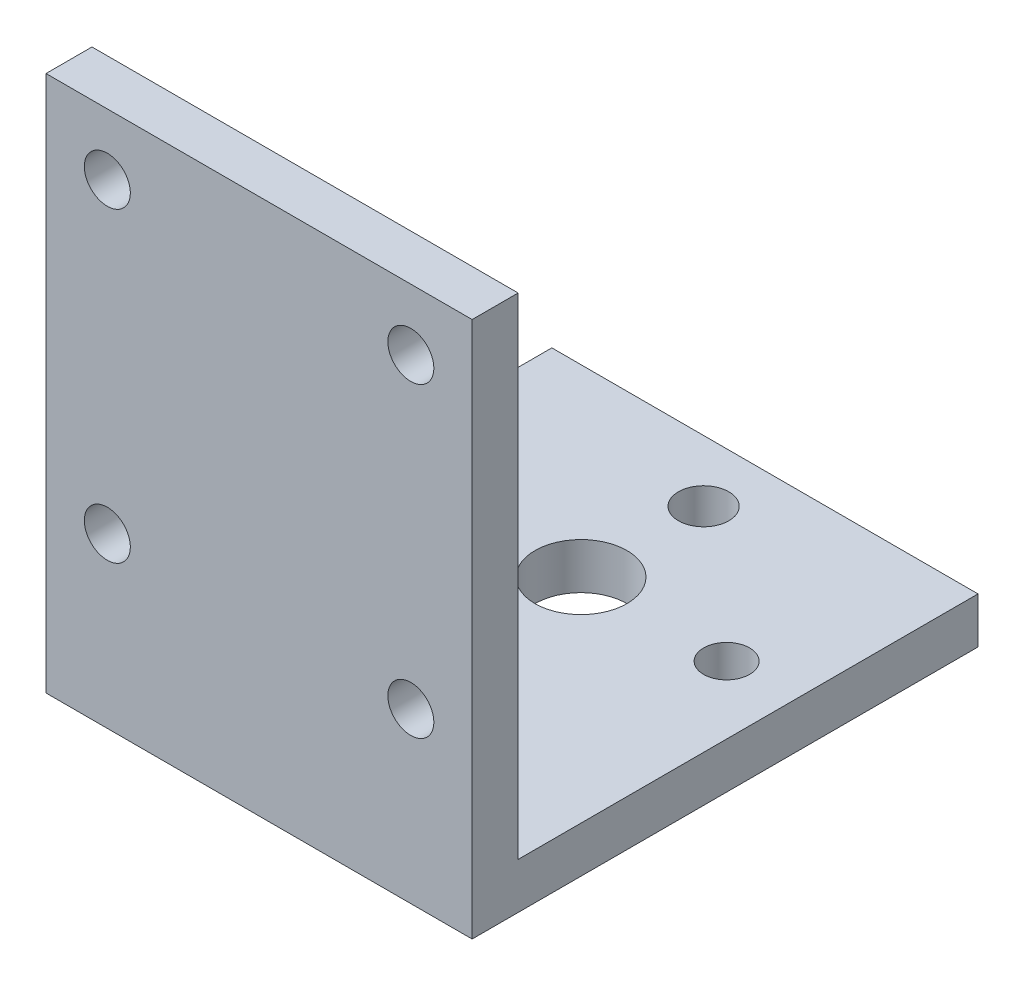
ISO-10303-21;
HEADER;
FILE_DESCRIPTION(('STEP AP214'),'2;1');
FILE_NAME('part.step','',(''),(''),'','','');
FILE_SCHEMA(('AUTOMOTIVE_DESIGN { 1 0 10303 214 1 1 1 1 }'));
ENDSEC;
DATA;
#1=APPLICATION_CONTEXT('core data for automotive mechanical design processes');
#2=APPLICATION_PROTOCOL_DEFINITION('international standard','automotive_design',2000,#1);
#3=PRODUCT_CONTEXT('',#1,'mechanical');
#4=PRODUCT('Part','Part','',(#3));
#5=PRODUCT_RELATED_PRODUCT_CATEGORY('part','',(#4));
#6=PRODUCT_DEFINITION_FORMATION('','',#4);
#7=PRODUCT_DEFINITION_CONTEXT('part definition',#1,'design');
#8=PRODUCT_DEFINITION('design','',#6,#7);
#9=PRODUCT_DEFINITION_SHAPE('','',#8);
#10=(LENGTH_UNIT() NAMED_UNIT(*) SI_UNIT(.MILLI.,.METRE.));
#11=(NAMED_UNIT(*) PLANE_ANGLE_UNIT() SI_UNIT($,.RADIAN.));
#12=(NAMED_UNIT(*) SI_UNIT($,.STERADIAN.) SOLID_ANGLE_UNIT());
#13=UNCERTAINTY_MEASURE_WITH_UNIT(LENGTH_MEASURE(1.E-05),#10,'distance_accuracy_value','');
#14=(GEOMETRIC_REPRESENTATION_CONTEXT(3) GLOBAL_UNCERTAINTY_ASSIGNED_CONTEXT((#13)) GLOBAL_UNIT_ASSIGNED_CONTEXT((#10,
#11,#12)) REPRESENTATION_CONTEXT('',''));
#15=CARTESIAN_POINT('',(0.,0.,0.));
#16=DIRECTION('',(0.,0.,1.));
#17=DIRECTION('',(1.,0.,0.));
#18=AXIS2_PLACEMENT_3D('',#15,#16,#17);
#19=CARTESIAN_POINT('',(0.,3.,0.));
#20=DIRECTION('',(0.,1.,0.));
#21=DIRECTION('',(0.,0.,1.));
#22=AXIS2_PLACEMENT_3D('',#19,#20,#21);
#23=PLANE('',#22);
#24=DIRECTION('',(-1.,0.,0.));
#25=VECTOR('',#24,1.);
#26=CARTESIAN_POINT('',(-77.7120976944037,3.,18.2292982112196));
#27=LINE('',#26,#25);
#28=CARTESIAN_POINT('',(-49.9120976944037,3.,18.2292982112196));
#29=VERTEX_POINT('',#28);
#30=CARTESIAN_POINT('',(-77.7120976944037,3.,18.2292982112196));
#31=VERTEX_POINT('',#30);
#32=EDGE_CURVE('E65',#29,#31,#27,.T.);
#33=ORIENTED_EDGE('',*,*,#32,.F.);
#34=DIRECTION('',(0.,0.,-1.));
#35=VECTOR('',#34,1.);
#36=CARTESIAN_POINT('',(-49.9120976944037,3.,-11.7707017887804));
#37=LINE('',#36,#35);
#38=CARTESIAN_POINT('',(-49.9120976944037,3.,-11.7707017887804));
#39=VERTEX_POINT('',#38);
#40=EDGE_CURVE('E210',#29,#39,#37,.T.);
#41=ORIENTED_EDGE('',*,*,#40,.T.);
#42=DIRECTION('',(-1.,0.,0.));
#43=VECTOR('',#42,1.);
#44=CARTESIAN_POINT('',(-77.7120976944037,3.,-11.7707017887804));
#45=LINE('',#44,#43);
#46=CARTESIAN_POINT('',(-77.7120976944037,3.,-11.7707017887804));
#47=VERTEX_POINT('',#46);
#48=EDGE_CURVE('E71',#39,#47,#45,.T.);
#49=ORIENTED_EDGE('',*,*,#48,.T.);
#50=DIRECTION('',(0.,0.,1.));
#51=VECTOR('',#50,1.);
#52=CARTESIAN_POINT('',(-77.7120976944037,3.,-11.7707017887804));
#53=LINE('',#52,#51);
#54=EDGE_CURVE('E101',#47,#31,#53,.T.);
#55=ORIENTED_EDGE('',*,*,#54,.T.);
#56=EDGE_LOOP('',(#33,#41,#49,#55));
#57=FACE_BOUND('',#56,.T.);
#58=CARTESIAN_POINT('',(-73.3120976944037,3.,0.229298211219559));
#59=DIRECTION('',(0.,1.,0.));
#60=DIRECTION('',(0.,0.,1.));
#61=AXIS2_PLACEMENT_3D('',#58,#59,#60);
#62=CIRCLE('',#61,1.5);
#63=CARTESIAN_POINT('',(-73.3120976944037,3.,1.72929821121956));
#64=VERTEX_POINT('',#63);
#65=EDGE_CURVE('E183',#64,#64,#62,.T.);
#66=ORIENTED_EDGE('',*,*,#65,.F.);
#67=EDGE_LOOP('',(#66));
#68=FACE_BOUND('',#67,.T.);
#69=CARTESIAN_POINT('',(-63.8120976944037,3.,0.229298211219559));
#70=DIRECTION('',(0.,1.,0.));
#71=DIRECTION('',(0.,0.,1.));
#72=AXIS2_PLACEMENT_3D('',#69,#70,#71);
#73=CIRCLE('',#72,3.);
#74=CARTESIAN_POINT('',(-63.8120976944037,3.,3.22929821121956));
#75=VERTEX_POINT('',#74);
#76=EDGE_CURVE('E199',#75,#75,#73,.T.);
#77=ORIENTED_EDGE('',*,*,#76,.F.);
#78=EDGE_LOOP('',(#77));
#79=FACE_BOUND('',#78,.T.);
#80=CARTESIAN_POINT('',(-63.8120976944037,3.,-7.77070178878044));
#81=DIRECTION('',(0.,1.,0.));
#82=DIRECTION('',(0.,0.,1.));
#83=AXIS2_PLACEMENT_3D('',#80,#81,#82);
#84=CIRCLE('',#83,1.64313429517779);
#85=CARTESIAN_POINT('',(-63.8120976944037,3.,-6.12756749360265));
#86=VERTEX_POINT('',#85);
#87=EDGE_CURVE('E115',#86,#86,#84,.T.);
#88=ORIENTED_EDGE('',*,*,#87,.F.);
#89=EDGE_LOOP('',(#88));
#90=FACE_BOUND('',#89,.T.);
#91=CARTESIAN_POINT('',(-63.8120976944037,3.,8.22929821121956));
#92=DIRECTION('',(0.,1.,0.));
#93=DIRECTION('',(0.,0.,1.));
#94=AXIS2_PLACEMENT_3D('',#91,#92,#93);
#95=CIRCLE('',#94,1.5);
#96=CARTESIAN_POINT('',(-63.8120976944037,3.,9.72929821121956));
#97=VERTEX_POINT('',#96);
#98=EDGE_CURVE('E191',#97,#97,#95,.T.);
#99=ORIENTED_EDGE('',*,*,#98,.F.);
#100=EDGE_LOOP('',(#99));
#101=FACE_BOUND('',#100,.T.);
#102=CARTESIAN_POINT('',(-54.3120976944037,3.,0.229298211219559));
#103=DIRECTION('',(0.,1.,0.));
#104=DIRECTION('',(0.,0.,1.));
#105=AXIS2_PLACEMENT_3D('',#102,#103,#104);
#106=CIRCLE('',#105,1.5);
#107=CARTESIAN_POINT('',(-54.3120976944037,3.,1.72929821121956));
#108=VERTEX_POINT('',#107);
#109=EDGE_CURVE('E175',#108,#108,#106,.T.);
#110=ORIENTED_EDGE('',*,*,#109,.F.);
#111=EDGE_LOOP('',(#110));
#112=FACE_BOUND('',#111,.T.);
#113=ADVANCED_FACE('F49',(#57,#68,#79,#90,#101,#112),#23,.T.);
#114=CARTESIAN_POINT('',(0.,0.,0.));
#115=DIRECTION('',(0.,1.,0.));
#116=DIRECTION('',(0.,0.,1.));
#117=AXIS2_PLACEMENT_3D('',#114,#115,#116);
#118=PLANE('',#117);
#119=DIRECTION('',(0.,0.,1.));
#120=VECTOR('',#119,1.);
#121=CARTESIAN_POINT('',(-77.7120976944037,0.,-11.7707017887804));
#122=LINE('',#121,#120);
#123=CARTESIAN_POINT('',(-77.7120976944037,0.,-11.7707017887804));
#124=VERTEX_POINT('',#123);
#125=CARTESIAN_POINT('',(-77.7120976944037,0.,21.2292982112196));
#126=VERTEX_POINT('',#125);
#127=EDGE_CURVE('E107',#124,#126,#122,.T.);
#128=ORIENTED_EDGE('',*,*,#127,.F.);
#129=DIRECTION('',(-1.,0.,0.));
#130=VECTOR('',#129,1.);
#131=CARTESIAN_POINT('',(-77.7120976944037,0.,-11.7707017887804));
#132=LINE('',#131,#130);
#133=CARTESIAN_POINT('',(-49.9120976944037,0.,-11.7707017887804));
#134=VERTEX_POINT('',#133);
#135=EDGE_CURVE('E90',#134,#124,#132,.T.);
#136=ORIENTED_EDGE('',*,*,#135,.F.);
#137=DIRECTION('',(0.,0.,-1.));
#138=VECTOR('',#137,1.);
#139=CARTESIAN_POINT('',(-49.9120976944037,0.,-11.7707017887804));
#140=LINE('',#139,#138);
#141=CARTESIAN_POINT('',(-49.9120976944037,0.,21.2292982112196));
#142=VERTEX_POINT('',#141);
#143=EDGE_CURVE('E102',#142,#134,#140,.T.);
#144=ORIENTED_EDGE('',*,*,#143,.F.);
#145=DIRECTION('',(1.,0.,0.));
#146=VECTOR('',#145,1.);
#147=CARTESIAN_POINT('',(-77.7120976944037,0.,21.2292982112196));
#148=LINE('',#147,#146);
#149=EDGE_CURVE('E113',#126,#142,#148,.T.);
#150=ORIENTED_EDGE('',*,*,#149,.F.);
#151=EDGE_LOOP('',(#128,#136,#144,#150));
#152=FACE_BOUND('',#151,.T.);
#153=CARTESIAN_POINT('',(-63.8120976944037,0.,-7.77070178878044));
#154=DIRECTION('',(0.,1.,0.));
#155=DIRECTION('',(0.,0.,1.));
#156=AXIS2_PLACEMENT_3D('',#153,#154,#155);
#157=CIRCLE('',#156,1.64313429517779);
#158=CARTESIAN_POINT('',(-63.8120976944037,0.,-6.12756749360265));
#159=VERTEX_POINT('',#158);
#160=EDGE_CURVE('E121',#159,#159,#157,.T.);
#161=ORIENTED_EDGE('',*,*,#160,.T.);
#162=EDGE_LOOP('',(#161));
#163=FACE_BOUND('',#162,.T.);
#164=CARTESIAN_POINT('',(-63.8120976944037,0.,0.229298211219559));
#165=DIRECTION('',(0.,1.,0.));
#166=DIRECTION('',(0.,0.,1.));
#167=AXIS2_PLACEMENT_3D('',#164,#165,#166);
#168=CIRCLE('',#167,3.);
#169=CARTESIAN_POINT('',(-63.8120976944037,0.,3.22929821121956));
#170=VERTEX_POINT('',#169);
#171=EDGE_CURVE('E195',#170,#170,#168,.T.);
#172=ORIENTED_EDGE('',*,*,#171,.T.);
#173=EDGE_LOOP('',(#172));
#174=FACE_BOUND('',#173,.T.);
#175=CARTESIAN_POINT('',(-63.8120976944037,0.,8.22929821121956));
#176=DIRECTION('',(0.,1.,0.));
#177=DIRECTION('',(0.,0.,1.));
#178=AXIS2_PLACEMENT_3D('',#175,#176,#177);
#179=CIRCLE('',#178,1.5);
#180=CARTESIAN_POINT('',(-63.8120976944037,0.,9.72929821121956));
#181=VERTEX_POINT('',#180);
#182=EDGE_CURVE('E187',#181,#181,#179,.T.);
#183=ORIENTED_EDGE('',*,*,#182,.T.);
#184=EDGE_LOOP('',(#183));
#185=FACE_BOUND('',#184,.T.);
#186=CARTESIAN_POINT('',(-73.3120976944037,0.,0.229298211219559));
#187=DIRECTION('',(0.,1.,0.));
#188=DIRECTION('',(0.,0.,1.));
#189=AXIS2_PLACEMENT_3D('',#186,#187,#188);
#190=CIRCLE('',#189,1.5);
#191=CARTESIAN_POINT('',(-73.3120976944037,0.,1.72929821121956));
#192=VERTEX_POINT('',#191);
#193=EDGE_CURVE('E179',#192,#192,#190,.T.);
#194=ORIENTED_EDGE('',*,*,#193,.T.);
#195=EDGE_LOOP('',(#194));
#196=FACE_BOUND('',#195,.T.);
#197=CARTESIAN_POINT('',(-54.3120976944037,0.,0.229298211219559));
#198=DIRECTION('',(0.,1.,0.));
#199=DIRECTION('',(0.,0.,1.));
#200=AXIS2_PLACEMENT_3D('',#197,#198,#199);
#201=CIRCLE('',#200,1.5);
#202=CARTESIAN_POINT('',(-54.3120976944037,0.,1.72929821121956));
#203=VERTEX_POINT('',#202);
#204=EDGE_CURVE('E174',#203,#203,#201,.T.);
#205=ORIENTED_EDGE('',*,*,#204,.T.);
#206=EDGE_LOOP('',(#205));
#207=FACE_BOUND('',#206,.T.);
#208=ADVANCED_FACE('F111',(#152,#163,#174,#185,#196,#207),#118,.F.);
#209=CARTESIAN_POINT('',(-77.7120976944037,3.,-11.7707017887804));
#210=DIRECTION('',(1.,0.,0.));
#211=DIRECTION('',(0.,0.,-1.));
#212=AXIS2_PLACEMENT_3D('',#209,#210,#211);
#213=PLANE('',#212);
#214=ORIENTED_EDGE('',*,*,#127,.T.);
#215=DIRECTION('',(0.,-1.,0.));
#216=VECTOR('',#215,1.);
#217=CARTESIAN_POINT('',(-77.7120976944037,3.,21.2292982112196));
#218=LINE('',#217,#216);
#219=CARTESIAN_POINT('',(-77.7120976944037,35.,21.2292982112196));
#220=VERTEX_POINT('',#219);
#221=EDGE_CURVE('E12',#220,#126,#218,.T.);
#222=ORIENTED_EDGE('',*,*,#221,.F.);
#223=DIRECTION('',(0.,0.,1.));
#224=VECTOR('',#223,1.);
#225=CARTESIAN_POINT('',(-77.7120976944037,35.,18.2292982112196));
#226=LINE('',#225,#224);
#227=CARTESIAN_POINT('',(-77.7120976944037,35.,18.2292982112196));
#228=VERTEX_POINT('',#227);
#229=EDGE_CURVE('E152',#228,#220,#226,.T.);
#230=ORIENTED_EDGE('',*,*,#229,.F.);
#231=DIRECTION('',(0.,-1.,0.));
#232=VECTOR('',#231,1.);
#233=CARTESIAN_POINT('',(-77.7120976944037,35.,18.2292982112196));
#234=LINE('',#233,#232);
#235=EDGE_CURVE('E164',#228,#31,#234,.T.);
#236=ORIENTED_EDGE('',*,*,#235,.T.);
#237=ORIENTED_EDGE('',*,*,#54,.F.);
#238=DIRECTION('',(0.,-1.,0.));
#239=VECTOR('',#238,1.);
#240=CARTESIAN_POINT('',(-77.7120976944037,3.,-11.7707017887804));
#241=LINE('',#240,#239);
#242=EDGE_CURVE('E93',#47,#124,#241,.T.);
#243=ORIENTED_EDGE('',*,*,#242,.T.);
#244=EDGE_LOOP('',(#214,#222,#230,#236,#237,#243));
#245=FACE_BOUND('',#244,.T.);
#246=ADVANCED_FACE('F51',(#245),#213,.F.);
#247=CARTESIAN_POINT('',(-77.7120976944037,3.,21.2292982112196));
#248=DIRECTION('',(0.,0.,-1.));
#249=DIRECTION('',(-1.,0.,0.));
#250=AXIS2_PLACEMENT_3D('',#247,#248,#249);
#251=PLANE('',#250);
#252=CARTESIAN_POINT('',(-73.7120976944037,11.,21.2292982112196));
#253=DIRECTION('',(0.,0.,-1.));
#254=DIRECTION('',(-1.,0.,0.));
#255=AXIS2_PLACEMENT_3D('',#252,#253,#254);
#256=CIRCLE('',#255,1.5);
#257=CARTESIAN_POINT('',(-75.2120976944037,11.,21.2292982112196));
#258=VERTEX_POINT('',#257);
#259=EDGE_CURVE('E167',#258,#258,#256,.T.);
#260=ORIENTED_EDGE('',*,*,#259,.T.);
#261=EDGE_LOOP('',(#260));
#262=FACE_BOUND('',#261,.T.);
#263=CARTESIAN_POINT('',(-53.9120976944037,31.,21.2292982112196));
#264=DIRECTION('',(0.,0.,-1.));
#265=DIRECTION('',(-1.,0.,0.));
#266=AXIS2_PLACEMENT_3D('',#263,#264,#265);
#267=CIRCLE('',#266,1.5);
#268=CARTESIAN_POINT('',(-55.4120976944037,31.,21.2292982112196));
#269=VERTEX_POINT('',#268);
#270=EDGE_CURVE('E261',#269,#269,#267,.T.);
#271=ORIENTED_EDGE('',*,*,#270,.T.);
#272=EDGE_LOOP('',(#271));
#273=FACE_BOUND('',#272,.T.);
#274=CARTESIAN_POINT('',(-73.7120976944037,31.,21.2292982112196));
#275=DIRECTION('',(0.,0.,-1.));
#276=DIRECTION('',(-1.,0.,0.));
#277=AXIS2_PLACEMENT_3D('',#274,#275,#276);
#278=CIRCLE('',#277,1.5);
#279=CARTESIAN_POINT('',(-75.2120976944037,31.,21.2292982112196));
#280=VERTEX_POINT('',#279);
#281=EDGE_CURVE('E265',#280,#280,#278,.T.);
#282=ORIENTED_EDGE('',*,*,#281,.T.);
#283=EDGE_LOOP('',(#282));
#284=FACE_BOUND('',#283,.T.);
#285=CARTESIAN_POINT('',(-53.9120976944037,11.,21.2292982112196));
#286=DIRECTION('',(0.,0.,-1.));
#287=DIRECTION('',(-1.,0.,0.));
#288=AXIS2_PLACEMENT_3D('',#285,#286,#287);
#289=CIRCLE('',#288,1.5);
#290=CARTESIAN_POINT('',(-55.4120976944037,11.,21.2292982112196));
#291=VERTEX_POINT('',#290);
#292=EDGE_CURVE('E268',#291,#291,#289,.T.);
#293=ORIENTED_EDGE('',*,*,#292,.T.);
#294=EDGE_LOOP('',(#293));
#295=FACE_BOUND('',#294,.T.);
#296=ORIENTED_EDGE('',*,*,#149,.T.);
#297=DIRECTION('',(0.,-1.,0.));
#298=VECTOR('',#297,1.);
#299=CARTESIAN_POINT('',(-49.9120976944037,3.,21.2292982112196));
#300=LINE('',#299,#298);
#301=CARTESIAN_POINT('',(-49.9120976944037,35.,21.2292982112196));
#302=VERTEX_POINT('',#301);
#303=EDGE_CURVE('E58',#302,#142,#300,.T.);
#304=ORIENTED_EDGE('',*,*,#303,.F.);
#305=DIRECTION('',(1.,0.,0.));
#306=VECTOR('',#305,1.);
#307=CARTESIAN_POINT('',(-77.7120976944037,35.,21.2292982112196));
#308=LINE('',#307,#306);
#309=EDGE_CURVE('E144',#220,#302,#308,.T.);
#310=ORIENTED_EDGE('',*,*,#309,.F.);
#311=ORIENTED_EDGE('',*,*,#221,.T.);
#312=EDGE_LOOP('',(#296,#304,#310,#311));
#313=FACE_BOUND('',#312,.T.);
#314=ADVANCED_FACE('F142',(#262,#273,#284,#295,#313),#251,.F.);
#315=CARTESIAN_POINT('',(-49.9120976944037,3.,-11.7707017887804));
#316=DIRECTION('',(-1.,0.,0.));
#317=DIRECTION('',(0.,0.,1.));
#318=AXIS2_PLACEMENT_3D('',#315,#316,#317);
#319=PLANE('',#318);
#320=ORIENTED_EDGE('',*,*,#143,.T.);
#321=DIRECTION('',(0.,-1.,0.));
#322=VECTOR('',#321,1.);
#323=CARTESIAN_POINT('',(-49.9120976944037,3.,-11.7707017887804));
#324=LINE('',#323,#322);
#325=EDGE_CURVE('E96',#39,#134,#324,.T.);
#326=ORIENTED_EDGE('',*,*,#325,.F.);
#327=ORIENTED_EDGE('',*,*,#40,.F.);
#328=DIRECTION('',(0.,-1.,0.));
#329=VECTOR('',#328,1.);
#330=CARTESIAN_POINT('',(-49.9120976944037,35.,18.2292982112196));
#331=LINE('',#330,#329);
#332=CARTESIAN_POINT('',(-49.9120976944037,35.,18.2292982112196));
#333=VERTEX_POINT('',#332);
#334=EDGE_CURVE('E170',#333,#29,#331,.T.);
#335=ORIENTED_EDGE('',*,*,#334,.F.);
#336=DIRECTION('',(0.,0.,-1.));
#337=VECTOR('',#336,1.);
#338=CARTESIAN_POINT('',(-49.9120976944037,35.,18.2292982112196));
#339=LINE('',#338,#337);
#340=EDGE_CURVE('E138',#302,#333,#339,.T.);
#341=ORIENTED_EDGE('',*,*,#340,.F.);
#342=ORIENTED_EDGE('',*,*,#303,.T.);
#343=EDGE_LOOP('',(#320,#326,#327,#335,#341,#342));
#344=FACE_BOUND('',#343,.T.);
#345=ADVANCED_FACE('F134',(#344),#319,.F.);
#346=CARTESIAN_POINT('',(-77.7120976944037,3.,-11.7707017887804));
#347=DIRECTION('',(0.,0.,1.));
#348=DIRECTION('',(1.,0.,0.));
#349=AXIS2_PLACEMENT_3D('',#346,#347,#348);
#350=PLANE('',#349);
#351=ORIENTED_EDGE('',*,*,#135,.T.);
#352=ORIENTED_EDGE('',*,*,#242,.F.);
#353=ORIENTED_EDGE('',*,*,#48,.F.);
#354=ORIENTED_EDGE('',*,*,#325,.T.);
#355=EDGE_LOOP('',(#351,#352,#353,#354));
#356=FACE_BOUND('',#355,.T.);
#357=ADVANCED_FACE('F92',(#356),#350,.F.);
#358=CARTESIAN_POINT('',(-63.8120976944037,3.,-7.77070178878044));
#359=DIRECTION('',(0.,-1.,0.));
#360=DIRECTION('',(0.,0.,-1.));
#361=AXIS2_PLACEMENT_3D('',#358,#359,#360);
#362=CYLINDRICAL_SURFACE('',#361,1.64313429517779);
#363=ORIENTED_EDGE('',*,*,#87,.T.);
#364=EDGE_LOOP('',(#363));
#365=FACE_BOUND('',#364,.T.);
#366=ORIENTED_EDGE('',*,*,#160,.F.);
#367=EDGE_LOOP('',(#366));
#368=FACE_BOUND('',#367,.T.);
#369=ADVANCED_FACE('F244',(#365,#368),#362,.F.);
#370=CARTESIAN_POINT('',(-63.8120976944037,3.,0.229298211219559));
#371=DIRECTION('',(0.,-1.,0.));
#372=DIRECTION('',(0.,0.,-1.));
#373=AXIS2_PLACEMENT_3D('',#370,#371,#372);
#374=CYLINDRICAL_SURFACE('',#373,3.);
#375=ORIENTED_EDGE('',*,*,#76,.T.);
#376=EDGE_LOOP('',(#375));
#377=FACE_BOUND('',#376,.T.);
#378=ORIENTED_EDGE('',*,*,#171,.F.);
#379=EDGE_LOOP('',(#378));
#380=FACE_BOUND('',#379,.T.);
#381=ADVANCED_FACE('F416',(#377,#380),#374,.F.);
#382=CARTESIAN_POINT('',(-63.8120976944037,3.,8.22929821121956));
#383=DIRECTION('',(0.,-1.,0.));
#384=DIRECTION('',(0.,0.,-1.));
#385=AXIS2_PLACEMENT_3D('',#382,#383,#384);
#386=CYLINDRICAL_SURFACE('',#385,1.5);
#387=ORIENTED_EDGE('',*,*,#98,.T.);
#388=EDGE_LOOP('',(#387));
#389=FACE_BOUND('',#388,.T.);
#390=ORIENTED_EDGE('',*,*,#182,.F.);
#391=EDGE_LOOP('',(#390));
#392=FACE_BOUND('',#391,.T.);
#393=ADVANCED_FACE('F405',(#389,#392),#386,.F.);
#394=CARTESIAN_POINT('',(-73.3120976944037,3.,0.229298211219559));
#395=DIRECTION('',(0.,-1.,0.));
#396=DIRECTION('',(0.,0.,-1.));
#397=AXIS2_PLACEMENT_3D('',#394,#395,#396);
#398=CYLINDRICAL_SURFACE('',#397,1.5);
#399=ORIENTED_EDGE('',*,*,#65,.T.);
#400=EDGE_LOOP('',(#399));
#401=FACE_BOUND('',#400,.T.);
#402=ORIENTED_EDGE('',*,*,#193,.F.);
#403=EDGE_LOOP('',(#402));
#404=FACE_BOUND('',#403,.T.);
#405=ADVANCED_FACE('F232',(#401,#404),#398,.F.);
#406=CARTESIAN_POINT('',(-54.3120976944037,3.,0.229298211219559));
#407=DIRECTION('',(0.,-1.,0.));
#408=DIRECTION('',(0.,0.,-1.));
#409=AXIS2_PLACEMENT_3D('',#406,#407,#408);
#410=CYLINDRICAL_SURFACE('',#409,1.5);
#411=ORIENTED_EDGE('',*,*,#109,.T.);
#412=EDGE_LOOP('',(#411));
#413=FACE_BOUND('',#412,.T.);
#414=ORIENTED_EDGE('',*,*,#204,.F.);
#415=EDGE_LOOP('',(#414));
#416=FACE_BOUND('',#415,.T.);
#417=ADVANCED_FACE('F223',(#413,#416),#410,.F.);
#418=CARTESIAN_POINT('',(-77.7120976944037,35.,18.2292982112196));
#419=DIRECTION('',(0.,0.,1.));
#420=DIRECTION('',(1.,0.,0.));
#421=AXIS2_PLACEMENT_3D('',#418,#419,#420);
#422=PLANE('',#421);
#423=CARTESIAN_POINT('',(-73.7120976944037,11.,18.2292982112196));
#424=DIRECTION('',(0.,0.,-1.));
#425=DIRECTION('',(-1.,0.,0.));
#426=AXIS2_PLACEMENT_3D('',#423,#424,#425);
#427=CIRCLE('',#426,1.5);
#428=CARTESIAN_POINT('',(-75.2120976944037,11.,18.2292982112196));
#429=VERTEX_POINT('',#428);
#430=EDGE_CURVE('E283',#429,#429,#427,.T.);
#431=ORIENTED_EDGE('',*,*,#430,.F.);
#432=EDGE_LOOP('',(#431));
#433=FACE_BOUND('',#432,.T.);
#434=CARTESIAN_POINT('',(-53.9120976944037,31.,18.2292982112196));
#435=DIRECTION('',(0.,0.,-1.));
#436=DIRECTION('',(-1.,0.,0.));
#437=AXIS2_PLACEMENT_3D('',#434,#435,#436);
#438=CIRCLE('',#437,1.5);
#439=CARTESIAN_POINT('',(-55.4120976944037,31.,18.2292982112196));
#440=VERTEX_POINT('',#439);
#441=EDGE_CURVE('E287',#440,#440,#438,.T.);
#442=ORIENTED_EDGE('',*,*,#441,.F.);
#443=EDGE_LOOP('',(#442));
#444=FACE_BOUND('',#443,.T.);
#445=CARTESIAN_POINT('',(-73.7120976944037,31.,18.2292982112196));
#446=DIRECTION('',(0.,0.,-1.));
#447=DIRECTION('',(-1.,0.,0.));
#448=AXIS2_PLACEMENT_3D('',#445,#446,#447);
#449=CIRCLE('',#448,1.5);
#450=CARTESIAN_POINT('',(-75.2120976944037,31.,18.2292982112196));
#451=VERTEX_POINT('',#450);
#452=EDGE_CURVE('E277',#451,#451,#449,.T.);
#453=ORIENTED_EDGE('',*,*,#452,.F.);
#454=EDGE_LOOP('',(#453));
#455=FACE_BOUND('',#454,.T.);
#456=CARTESIAN_POINT('',(-53.9120976944037,11.,18.2292982112196));
#457=DIRECTION('',(0.,0.,-1.));
#458=DIRECTION('',(-1.,0.,0.));
#459=AXIS2_PLACEMENT_3D('',#456,#457,#458);
#460=CIRCLE('',#459,1.5);
#461=CARTESIAN_POINT('',(-55.4120976944037,11.,18.2292982112196));
#462=VERTEX_POINT('',#461);
#463=EDGE_CURVE('E271',#462,#462,#460,.T.);
#464=ORIENTED_EDGE('',*,*,#463,.F.);
#465=EDGE_LOOP('',(#464));
#466=FACE_BOUND('',#465,.T.);
#467=ORIENTED_EDGE('',*,*,#32,.T.);
#468=ORIENTED_EDGE('',*,*,#235,.F.);
#469=DIRECTION('',(-1.,0.,0.));
#470=VECTOR('',#469,1.);
#471=CARTESIAN_POINT('',(-77.7120976944037,35.,18.2292982112196));
#472=LINE('',#471,#470);
#473=EDGE_CURVE('E157',#333,#228,#472,.T.);
#474=ORIENTED_EDGE('',*,*,#473,.F.);
#475=ORIENTED_EDGE('',*,*,#334,.T.);
#476=EDGE_LOOP('',(#467,#468,#474,#475));
#477=FACE_BOUND('',#476,.T.);
#478=ADVANCED_FACE('F216',(#433,#444,#455,#466,#477),#422,.F.);
#479=CARTESIAN_POINT('',(0.,35.,0.));
#480=DIRECTION('',(0.,1.,0.));
#481=DIRECTION('',(0.,0.,1.));
#482=AXIS2_PLACEMENT_3D('',#479,#480,#481);
#483=PLANE('',#482);
#484=ORIENTED_EDGE('',*,*,#229,.T.);
#485=ORIENTED_EDGE('',*,*,#309,.T.);
#486=ORIENTED_EDGE('',*,*,#340,.T.);
#487=ORIENTED_EDGE('',*,*,#473,.T.);
#488=EDGE_LOOP('',(#484,#485,#486,#487));
#489=FACE_BOUND('',#488,.T.);
#490=ADVANCED_FACE('F149',(#489),#483,.T.);
#491=CARTESIAN_POINT('',(-53.9120976944037,11.,50.2292982112196));
#492=DIRECTION('',(0.,0.,-1.));
#493=DIRECTION('',(-1.,0.,0.));
#494=AXIS2_PLACEMENT_3D('',#491,#492,#493);
#495=CYLINDRICAL_SURFACE('',#494,1.5);
#496=ORIENTED_EDGE('',*,*,#463,.T.);
#497=EDGE_LOOP('',(#496));
#498=FACE_BOUND('',#497,.T.);
#499=ORIENTED_EDGE('',*,*,#292,.F.);
#500=EDGE_LOOP('',(#499));
#501=FACE_BOUND('',#500,.T.);
#502=ADVANCED_FACE('F230',(#498,#501),#495,.F.);
#503=CARTESIAN_POINT('',(-73.7120976944037,31.,50.2292982112196));
#504=DIRECTION('',(0.,0.,-1.));
#505=DIRECTION('',(-1.,0.,0.));
#506=AXIS2_PLACEMENT_3D('',#503,#504,#505);
#507=CYLINDRICAL_SURFACE('',#506,1.5);
#508=ORIENTED_EDGE('',*,*,#452,.T.);
#509=EDGE_LOOP('',(#508));
#510=FACE_BOUND('',#509,.T.);
#511=ORIENTED_EDGE('',*,*,#281,.F.);
#512=EDGE_LOOP('',(#511));
#513=FACE_BOUND('',#512,.T.);
#514=ADVANCED_FACE('F295',(#510,#513),#507,.F.);
#515=CARTESIAN_POINT('',(-53.9120976944037,31.,50.2292982112196));
#516=DIRECTION('',(0.,0.,-1.));
#517=DIRECTION('',(-1.,0.,0.));
#518=AXIS2_PLACEMENT_3D('',#515,#516,#517);
#519=CYLINDRICAL_SURFACE('',#518,1.5);
#520=ORIENTED_EDGE('',*,*,#441,.T.);
#521=EDGE_LOOP('',(#520));
#522=FACE_BOUND('',#521,.T.);
#523=ORIENTED_EDGE('',*,*,#270,.F.);
#524=EDGE_LOOP('',(#523));
#525=FACE_BOUND('',#524,.T.);
#526=ADVANCED_FACE('F306',(#522,#525),#519,.F.);
#527=CARTESIAN_POINT('',(-73.7120976944037,11.,50.2292982112196));
#528=DIRECTION('',(0.,0.,-1.));
#529=DIRECTION('',(-1.,0.,0.));
#530=AXIS2_PLACEMENT_3D('',#527,#528,#529);
#531=CYLINDRICAL_SURFACE('',#530,1.5);
#532=ORIENTED_EDGE('',*,*,#430,.T.);
#533=EDGE_LOOP('',(#532));
#534=FACE_BOUND('',#533,.T.);
#535=ORIENTED_EDGE('',*,*,#259,.F.);
#536=EDGE_LOOP('',(#535));
#537=FACE_BOUND('',#536,.T.);
#538=ADVANCED_FACE('F309',(#534,#537),#531,.F.);
#539=CLOSED_SHELL('',(#113,#208,#246,#314,#345,#357,#369,#381,#393,#405,#417,#478,#490,#502,
#514,#526,#538));
#540=MANIFOLD_SOLID_BREP('B2',#539);
#541=ADVANCED_BREP_SHAPE_REPRESENTATION('',(#18,#540),#14);
#542=SHAPE_DEFINITION_REPRESENTATION(#9,#541);
ENDSEC;
END-ISO-10303-21;
